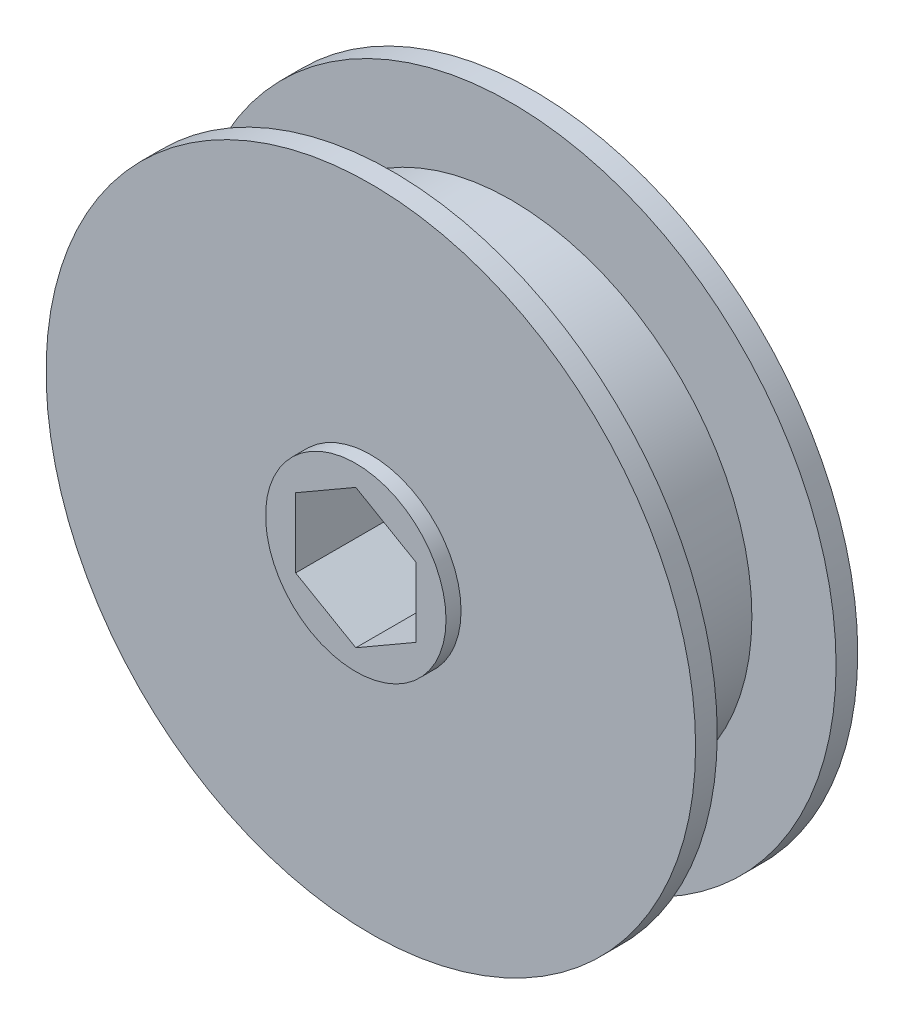
ISO-10303-21;
HEADER;
FILE_DESCRIPTION(('STEP AP214'),'2;1');
FILE_NAME('part.step','',(''),(''),'','','');
FILE_SCHEMA(('AUTOMOTIVE_DESIGN { 1 0 10303 214 1 1 1 1 }'));
ENDSEC;
DATA;
#1=APPLICATION_CONTEXT('core data for automotive mechanical design processes');
#2=APPLICATION_PROTOCOL_DEFINITION('international standard','automotive_design',2000,#1);
#3=PRODUCT_CONTEXT('',#1,'mechanical');
#4=PRODUCT('Part','Part','',(#3));
#5=PRODUCT_RELATED_PRODUCT_CATEGORY('part','',(#4));
#6=PRODUCT_DEFINITION_FORMATION('','',#4);
#7=PRODUCT_DEFINITION_CONTEXT('part definition',#1,'design');
#8=PRODUCT_DEFINITION('design','',#6,#7);
#9=PRODUCT_DEFINITION_SHAPE('','',#8);
#10=(LENGTH_UNIT() NAMED_UNIT(*) SI_UNIT(.MILLI.,.METRE.));
#11=(NAMED_UNIT(*) PLANE_ANGLE_UNIT() SI_UNIT($,.RADIAN.));
#12=(NAMED_UNIT(*) SI_UNIT($,.STERADIAN.) SOLID_ANGLE_UNIT());
#13=UNCERTAINTY_MEASURE_WITH_UNIT(LENGTH_MEASURE(1.E-05),#10,'distance_accuracy_value','');
#14=(GEOMETRIC_REPRESENTATION_CONTEXT(3) GLOBAL_UNCERTAINTY_ASSIGNED_CONTEXT((#13)) GLOBAL_UNIT_ASSIGNED_CONTEXT((#10,
#11,#12)) REPRESENTATION_CONTEXT('',''));
#15=CARTESIAN_POINT('',(0.,0.,0.));
#16=DIRECTION('',(0.,0.,1.));
#17=DIRECTION('',(1.,0.,0.));
#18=AXIS2_PLACEMENT_3D('',#15,#16,#17);
#19=CARTESIAN_POINT('',(0.,0.,-10.1473));
#20=DIRECTION('',(0.,0.,1.));
#21=DIRECTION('',(1.,0.,0.));
#22=AXIS2_PLACEMENT_3D('',#19,#20,#21);
#23=CYLINDRICAL_SURFACE('',#22,34.29);
#24=CARTESIAN_POINT('',(0.,0.,-6.2738));
#25=DIRECTION('',(0.,0.,1.));
#26=DIRECTION('',(1.,0.,0.));
#27=AXIS2_PLACEMENT_3D('',#24,#25,#26);
#28=CIRCLE('',#27,34.29);
#29=CARTESIAN_POINT('',(34.29,0.,-6.2738));
#30=VERTEX_POINT('',#29);
#31=EDGE_CURVE('E139',#30,#30,#28,.T.);
#32=ORIENTED_EDGE('',*,*,#31,.F.);
#33=EDGE_LOOP('',(#32));
#34=FACE_BOUND('',#33,.T.);
#35=CARTESIAN_POINT('',(0.,0.,-8.5598));
#36=DIRECTION('',(0.,0.,1.));
#37=DIRECTION('',(1.,0.,0.));
#38=AXIS2_PLACEMENT_3D('',#35,#36,#37);
#39=CIRCLE('',#38,34.29);
#40=CARTESIAN_POINT('',(34.29,0.,-8.5598));
#41=VERTEX_POINT('',#40);
#42=EDGE_CURVE('E116',#41,#41,#39,.T.);
#43=ORIENTED_EDGE('',*,*,#42,.T.);
#44=EDGE_LOOP('',(#43));
#45=FACE_BOUND('',#44,.T.);
#46=ADVANCED_FACE('F45',(#34,#45),#23,.T.);
#47=CARTESIAN_POINT('',(0.,0.,-10.1473));
#48=DIRECTION('',(0.,0.,-1.));
#49=DIRECTION('',(1.,0.,0.));
#50=AXIS2_PLACEMENT_3D('',#47,#48,#49);
#51=PLANE('',#50);
#52=DIRECTION('',(-0.866025403784441,0.499999999999995,0.));
#53=VECTOR('',#52,1.);
#54=CARTESIAN_POINT('',(6.34999999999996,3.6661742093542,-10.1473));
#55=LINE('',#54,#53);
#56=CARTESIAN_POINT('',(6.34999999999996,3.6661742093542,-10.1473));
#57=VERTEX_POINT('',#56);
#58=CARTESIAN_POINT('',(0.,7.33234841870825,-10.1473));
#59=VERTEX_POINT('',#58);
#60=EDGE_CURVE('E110',#57,#59,#55,.T.);
#61=ORIENTED_EDGE('',*,*,#60,.T.);
#62=DIRECTION('',(-0.866025403784438,-0.500000000000001,0.));
#63=VECTOR('',#62,1.);
#64=CARTESIAN_POINT('',(0.,7.33234841870825,-10.1473));
#65=LINE('',#64,#63);
#66=CARTESIAN_POINT('',(-6.35000000000001,3.66617420935411,-10.1473));
#67=VERTEX_POINT('',#66);
#68=EDGE_CURVE('E136',#59,#67,#65,.T.);
#69=ORIENTED_EDGE('',*,*,#68,.T.);
#70=DIRECTION('',(0.,-1.,0.));
#71=VECTOR('',#70,1.);
#72=CARTESIAN_POINT('',(-6.35000000000001,3.66617420935411,-10.1473));
#73=LINE('',#72,#71);
#74=CARTESIAN_POINT('',(-6.34999999999998,-3.66617420935415,-10.1473));
#75=VERTEX_POINT('',#74);
#76=EDGE_CURVE('E132',#67,#75,#73,.T.);
#77=ORIENTED_EDGE('',*,*,#76,.T.);
#78=DIRECTION('',(0.866025403784441,-0.499999999999995,0.));
#79=VECTOR('',#78,1.);
#80=CARTESIAN_POINT('',(-6.34999999999998,-3.66617420935415,-10.1473));
#81=LINE('',#80,#79);
#82=CARTESIAN_POINT('',(0.,-7.33234841870825,-10.1473));
#83=VERTEX_POINT('',#82);
#84=EDGE_CURVE('E126',#75,#83,#81,.T.);
#85=ORIENTED_EDGE('',*,*,#84,.T.);
#86=DIRECTION('',(0.866025403784435,0.500000000000007,0.));
#87=VECTOR('',#86,1.);
#88=CARTESIAN_POINT('',(0.,-7.33234841870825,-10.1473));
#89=LINE('',#88,#87);
#90=CARTESIAN_POINT('',(6.35000000000003,-3.66617420935406,-10.1473));
#91=VERTEX_POINT('',#90);
#92=EDGE_CURVE('E122',#83,#91,#89,.T.);
#93=ORIENTED_EDGE('',*,*,#92,.T.);
#94=DIRECTION('',(0.,1.,0.));
#95=VECTOR('',#94,1.);
#96=CARTESIAN_POINT('',(6.35000000000003,-3.66617420935406,-10.1473));
#97=LINE('',#96,#95);
#98=EDGE_CURVE('E101',#91,#57,#97,.T.);
#99=ORIENTED_EDGE('',*,*,#98,.T.);
#100=EDGE_LOOP('',(#61,#69,#77,#85,#93,#99));
#101=FACE_BOUND('',#100,.T.);
#102=CARTESIAN_POINT('',(0.,0.,-10.1473));
#103=DIRECTION('',(0.,0.,1.));
#104=DIRECTION('',(1.,0.,0.));
#105=AXIS2_PLACEMENT_3D('',#102,#103,#104);
#106=CIRCLE('',#105,9.525);
#107=CARTESIAN_POINT('',(9.525,0.,-10.1473));
#108=VERTEX_POINT('',#107);
#109=EDGE_CURVE('E253',#108,#108,#106,.T.);
#110=ORIENTED_EDGE('',*,*,#109,.F.);
#111=EDGE_LOOP('',(#110));
#112=FACE_BOUND('',#111,.T.);
#113=ADVANCED_FACE('F118',(#101,#112),#51,.T.);
#114=CARTESIAN_POINT('',(0.,0.,8.21055));
#115=DIRECTION('',(0.,0.,-1.));
#116=DIRECTION('',(-1.,0.,0.));
#117=AXIS2_PLACEMENT_3D('',#114,#115,#116);
#118=CYLINDRICAL_SURFACE('',#117,25.4);
#119=CARTESIAN_POINT('',(0.,0.,6.2738));
#120=DIRECTION('',(0.,0.,1.));
#121=DIRECTION('',(1.,0.,0.));
#122=AXIS2_PLACEMENT_3D('',#119,#120,#121);
#123=CIRCLE('',#122,25.4);
#124=CARTESIAN_POINT('',(25.4,0.,6.2738));
#125=VERTEX_POINT('',#124);
#126=EDGE_CURVE('E55',#125,#125,#123,.T.);
#127=ORIENTED_EDGE('',*,*,#126,.F.);
#128=EDGE_LOOP('',(#127));
#129=FACE_BOUND('',#128,.T.);
#130=CARTESIAN_POINT('',(0.,0.,-6.2738));
#131=DIRECTION('',(0.,0.,-1.));
#132=DIRECTION('',(-1.,0.,0.));
#133=AXIS2_PLACEMENT_3D('',#130,#131,#132);
#134=CIRCLE('',#133,25.4);
#135=CARTESIAN_POINT('',(-25.4,0.,-6.2738));
#136=VERTEX_POINT('',#135);
#137=EDGE_CURVE('E11',#136,#136,#134,.T.);
#138=ORIENTED_EDGE('',*,*,#137,.F.);
#139=EDGE_LOOP('',(#138));
#140=FACE_BOUND('',#139,.T.);
#141=ADVANCED_FACE('F47',(#129,#140),#118,.T.);
#142=CARTESIAN_POINT('',(0.,0.,10.1473));
#143=DIRECTION('',(0.,0.,1.));
#144=DIRECTION('',(1.,0.,0.));
#145=AXIS2_PLACEMENT_3D('',#142,#143,#144);
#146=PLANE('',#145);
#147=DIRECTION('',(-0.866025403784438,-0.500000000000001,0.));
#148=VECTOR('',#147,1.);
#149=CARTESIAN_POINT('',(0.,7.33234841870825,10.1473));
#150=LINE('',#149,#148);
#151=CARTESIAN_POINT('',(0.,7.33234841870825,10.1473));
#152=VERTEX_POINT('',#151);
#153=CARTESIAN_POINT('',(-6.35000000000001,3.66617420935411,10.1473));
#154=VERTEX_POINT('',#153);
#155=EDGE_CURVE('E158',#152,#154,#150,.T.);
#156=ORIENTED_EDGE('',*,*,#155,.F.);
#157=DIRECTION('',(-0.866025403784441,0.499999999999995,0.));
#158=VECTOR('',#157,1.);
#159=CARTESIAN_POINT('',(6.34999999999996,3.6661742093542,10.1473));
#160=LINE('',#159,#158);
#161=CARTESIAN_POINT('',(6.34999999999996,3.6661742093542,10.1473));
#162=VERTEX_POINT('',#161);
#163=EDGE_CURVE('E155',#162,#152,#160,.T.);
#164=ORIENTED_EDGE('',*,*,#163,.F.);
#165=DIRECTION('',(0.,1.,0.));
#166=VECTOR('',#165,1.);
#167=CARTESIAN_POINT('',(6.35000000000003,-3.66617420935406,10.1473));
#168=LINE('',#167,#166);
#169=CARTESIAN_POINT('',(6.35000000000003,-3.66617420935406,10.1473));
#170=VERTEX_POINT('',#169);
#171=EDGE_CURVE('E104',#170,#162,#168,.T.);
#172=ORIENTED_EDGE('',*,*,#171,.F.);
#173=DIRECTION('',(0.866025403784435,0.500000000000007,0.));
#174=VECTOR('',#173,1.);
#175=CARTESIAN_POINT('',(0.,-7.33234841870825,10.1473));
#176=LINE('',#175,#174);
#177=CARTESIAN_POINT('',(0.,-7.33234841870825,10.1473));
#178=VERTEX_POINT('',#177);
#179=EDGE_CURVE('E170',#178,#170,#176,.T.);
#180=ORIENTED_EDGE('',*,*,#179,.F.);
#181=DIRECTION('',(0.866025403784441,-0.499999999999995,0.));
#182=VECTOR('',#181,1.);
#183=CARTESIAN_POINT('',(-6.34999999999998,-3.66617420935415,10.1473));
#184=LINE('',#183,#182);
#185=CARTESIAN_POINT('',(-6.34999999999998,-3.66617420935415,10.1473));
#186=VERTEX_POINT('',#185);
#187=EDGE_CURVE('E166',#186,#178,#184,.T.);
#188=ORIENTED_EDGE('',*,*,#187,.F.);
#189=DIRECTION('',(0.,-1.,0.));
#190=VECTOR('',#189,1.);
#191=CARTESIAN_POINT('',(-6.35000000000001,3.66617420935411,10.1473));
#192=LINE('',#191,#190);
#193=EDGE_CURVE('E162',#154,#186,#192,.T.);
#194=ORIENTED_EDGE('',*,*,#193,.F.);
#195=EDGE_LOOP('',(#156,#164,#172,#180,#188,#194));
#196=FACE_BOUND('',#195,.T.);
#197=CARTESIAN_POINT('',(0.,0.,10.1473));
#198=DIRECTION('',(0.,0.,1.));
#199=DIRECTION('',(1.,0.,0.));
#200=AXIS2_PLACEMENT_3D('',#197,#198,#199);
#201=CIRCLE('',#200,9.525);
#202=CARTESIAN_POINT('',(9.525,0.,10.1473));
#203=VERTEX_POINT('',#202);
#204=EDGE_CURVE('E142',#203,#203,#201,.T.);
#205=ORIENTED_EDGE('',*,*,#204,.T.);
#206=EDGE_LOOP('',(#205));
#207=FACE_BOUND('',#206,.T.);
#208=ADVANCED_FACE('F206',(#196,#207),#146,.T.);
#209=CARTESIAN_POINT('',(0.,0.,10.1473));
#210=DIRECTION('',(0.,0.,-1.));
#211=DIRECTION('',(-1.,0.,0.));
#212=AXIS2_PLACEMENT_3D('',#209,#210,#211);
#213=CYLINDRICAL_SURFACE('',#212,34.29);
#214=CARTESIAN_POINT('',(0.,0.,6.2738));
#215=DIRECTION('',(0.,0.,1.));
#216=DIRECTION('',(1.,0.,0.));
#217=AXIS2_PLACEMENT_3D('',#214,#215,#216);
#218=CIRCLE('',#217,34.29);
#219=CARTESIAN_POINT('',(34.29,0.,6.2738));
#220=VERTEX_POINT('',#219);
#221=EDGE_CURVE('E107',#220,#220,#218,.T.);
#222=ORIENTED_EDGE('',*,*,#221,.T.);
#223=EDGE_LOOP('',(#222));
#224=FACE_BOUND('',#223,.T.);
#225=CARTESIAN_POINT('',(0.,0.,8.5598));
#226=DIRECTION('',(0.,0.,1.));
#227=DIRECTION('',(1.,0.,0.));
#228=AXIS2_PLACEMENT_3D('',#225,#226,#227);
#229=CIRCLE('',#228,34.29);
#230=CARTESIAN_POINT('',(34.29,0.,8.5598));
#231=VERTEX_POINT('',#230);
#232=EDGE_CURVE('E148',#231,#231,#229,.T.);
#233=ORIENTED_EDGE('',*,*,#232,.F.);
#234=EDGE_LOOP('',(#233));
#235=FACE_BOUND('',#234,.T.);
#236=ADVANCED_FACE('F209',(#224,#235),#213,.T.);
#237=CARTESIAN_POINT('',(6.34999999999999,3.66617420935413,8.21055));
#238=DIRECTION('',(-0.5,-0.866025403784439,0.));
#239=DIRECTION('',(0.866025403784439,-0.5,0.));
#240=AXIS2_PLACEMENT_3D('',#237,#238,#239);
#241=PLANE('',#240);
#242=ORIENTED_EDGE('',*,*,#60,.F.);
#243=DIRECTION('',(0.,0.,-1.));
#244=VECTOR('',#243,1.);
#245=CARTESIAN_POINT('',(6.34999999999999,3.66617420935413,8.21055));
#246=LINE('',#245,#244);
#247=EDGE_CURVE('E71',#162,#57,#246,.T.);
#248=ORIENTED_EDGE('',*,*,#247,.F.);
#249=ORIENTED_EDGE('',*,*,#163,.T.);
#250=DIRECTION('',(0.,0.,-1.));
#251=VECTOR('',#250,1.);
#252=CARTESIAN_POINT('',(0.,7.33234841870825,8.21055));
#253=LINE('',#252,#251);
#254=EDGE_CURVE('E49',#152,#59,#253,.T.);
#255=ORIENTED_EDGE('',*,*,#254,.T.);
#256=EDGE_LOOP('',(#242,#248,#249,#255));
#257=FACE_BOUND('',#256,.T.);
#258=ADVANCED_FACE('F111',(#257),#241,.T.);
#259=CARTESIAN_POINT('',(0.,7.33234841870825,8.21055));
#260=DIRECTION('',(0.5,-0.866025403784439,0.));
#261=DIRECTION('',(0.866025403784439,0.5,0.));
#262=AXIS2_PLACEMENT_3D('',#259,#260,#261);
#263=PLANE('',#262);
#264=ORIENTED_EDGE('',*,*,#68,.F.);
#265=ORIENTED_EDGE('',*,*,#254,.F.);
#266=ORIENTED_EDGE('',*,*,#155,.T.);
#267=DIRECTION('',(0.,0.,-1.));
#268=VECTOR('',#267,1.);
#269=CARTESIAN_POINT('',(-6.35,3.66617420935412,8.21055));
#270=LINE('',#269,#268);
#271=EDGE_CURVE('E188',#154,#67,#270,.T.);
#272=ORIENTED_EDGE('',*,*,#271,.T.);
#273=EDGE_LOOP('',(#264,#265,#266,#272));
#274=FACE_BOUND('',#273,.T.);
#275=ADVANCED_FACE('F193',(#274),#263,.T.);
#276=CARTESIAN_POINT('',(-6.35,3.66617420935412,8.21055));
#277=DIRECTION('',(1.,0.,0.));
#278=DIRECTION('',(0.,1.,0.));
#279=AXIS2_PLACEMENT_3D('',#276,#277,#278);
#280=PLANE('',#279);
#281=ORIENTED_EDGE('',*,*,#76,.F.);
#282=ORIENTED_EDGE('',*,*,#271,.F.);
#283=ORIENTED_EDGE('',*,*,#193,.T.);
#284=DIRECTION('',(0.,0.,-1.));
#285=VECTOR('',#284,1.);
#286=CARTESIAN_POINT('',(-6.35,-3.66617420935412,8.21055));
#287=LINE('',#286,#285);
#288=EDGE_CURVE('E186',#186,#75,#287,.T.);
#289=ORIENTED_EDGE('',*,*,#288,.T.);
#290=EDGE_LOOP('',(#281,#282,#283,#289));
#291=FACE_BOUND('',#290,.T.);
#292=ADVANCED_FACE('F197',(#291),#280,.T.);
#293=CARTESIAN_POINT('',(-6.35,-3.66617420935412,8.21055));
#294=DIRECTION('',(0.5,0.866025403784439,0.));
#295=DIRECTION('',(-0.866025403784439,0.5,0.));
#296=AXIS2_PLACEMENT_3D('',#293,#294,#295);
#297=PLANE('',#296);
#298=ORIENTED_EDGE('',*,*,#84,.F.);
#299=ORIENTED_EDGE('',*,*,#288,.F.);
#300=ORIENTED_EDGE('',*,*,#187,.T.);
#301=DIRECTION('',(0.,0.,-1.));
#302=VECTOR('',#301,1.);
#303=CARTESIAN_POINT('',(0.,-7.33234841870825,8.21055));
#304=LINE('',#303,#302);
#305=EDGE_CURVE('E183',#178,#83,#304,.T.);
#306=ORIENTED_EDGE('',*,*,#305,.T.);
#307=EDGE_LOOP('',(#298,#299,#300,#306));
#308=FACE_BOUND('',#307,.T.);
#309=ADVANCED_FACE('F200',(#308),#297,.T.);
#310=CARTESIAN_POINT('',(0.,-7.33234841870825,8.21055));
#311=DIRECTION('',(-0.5,0.866025403784439,0.));
#312=DIRECTION('',(-0.866025403784439,-0.5,0.));
#313=AXIS2_PLACEMENT_3D('',#310,#311,#312);
#314=PLANE('',#313);
#315=ORIENTED_EDGE('',*,*,#92,.F.);
#316=ORIENTED_EDGE('',*,*,#305,.F.);
#317=ORIENTED_EDGE('',*,*,#179,.T.);
#318=DIRECTION('',(0.,0.,-1.));
#319=VECTOR('',#318,1.);
#320=CARTESIAN_POINT('',(6.34999999999999,-3.66617420935413,8.21055));
#321=LINE('',#320,#319);
#322=EDGE_CURVE('E63',#170,#91,#321,.T.);
#323=ORIENTED_EDGE('',*,*,#322,.T.);
#324=EDGE_LOOP('',(#315,#316,#317,#323));
#325=FACE_BOUND('',#324,.T.);
#326=ADVANCED_FACE('F204',(#325),#314,.T.);
#327=CARTESIAN_POINT('',(6.34999999999999,-3.66617420935413,8.21055));
#328=DIRECTION('',(-1.,0.,0.));
#329=DIRECTION('',(0.,0.,1.));
#330=AXIS2_PLACEMENT_3D('',#327,#328,#329);
#331=PLANE('',#330);
#332=ORIENTED_EDGE('',*,*,#98,.F.);
#333=ORIENTED_EDGE('',*,*,#322,.F.);
#334=ORIENTED_EDGE('',*,*,#171,.T.);
#335=ORIENTED_EDGE('',*,*,#247,.T.);
#336=EDGE_LOOP('',(#332,#333,#334,#335));
#337=FACE_BOUND('',#336,.T.);
#338=ADVANCED_FACE('F99',(#337),#331,.T.);
#339=CARTESIAN_POINT('',(0.,0.,6.2738));
#340=DIRECTION('',(0.,0.,1.));
#341=DIRECTION('',(1.,0.,0.));
#342=AXIS2_PLACEMENT_3D('',#339,#340,#341);
#343=PLANE('',#342);
#344=ORIENTED_EDGE('',*,*,#221,.F.);
#345=EDGE_LOOP('',(#344));
#346=FACE_BOUND('',#345,.T.);
#347=ORIENTED_EDGE('',*,*,#126,.T.);
#348=EDGE_LOOP('',(#347));
#349=FACE_BOUND('',#348,.T.);
#350=ADVANCED_FACE('F227',(#346,#349),#343,.F.);
#351=CARTESIAN_POINT('',(0.,0.,8.5598));
#352=DIRECTION('',(0.,0.,1.));
#353=DIRECTION('',(1.,0.,0.));
#354=AXIS2_PLACEMENT_3D('',#351,#352,#353);
#355=PLANE('',#354);
#356=CARTESIAN_POINT('',(0.,0.,8.5598));
#357=DIRECTION('',(0.,0.,1.));
#358=DIRECTION('',(1.,0.,0.));
#359=AXIS2_PLACEMENT_3D('',#356,#357,#358);
#360=CIRCLE('',#359,9.525);
#361=CARTESIAN_POINT('',(9.525,0.,8.5598));
#362=VERTEX_POINT('',#361);
#363=EDGE_CURVE('E144',#362,#362,#360,.T.);
#364=ORIENTED_EDGE('',*,*,#363,.F.);
#365=EDGE_LOOP('',(#364));
#366=FACE_BOUND('',#365,.T.);
#367=ORIENTED_EDGE('',*,*,#232,.T.);
#368=EDGE_LOOP('',(#367));
#369=FACE_BOUND('',#368,.T.);
#370=ADVANCED_FACE('F216',(#366,#369),#355,.T.);
#371=CARTESIAN_POINT('',(0.,0.,8.5598));
#372=DIRECTION('',(0.,0.,1.));
#373=DIRECTION('',(1.,0.,0.));
#374=AXIS2_PLACEMENT_3D('',#371,#372,#373);
#375=CYLINDRICAL_SURFACE('',#374,9.525);
#376=ORIENTED_EDGE('',*,*,#363,.T.);
#377=EDGE_LOOP('',(#376));
#378=FACE_BOUND('',#377,.T.);
#379=ORIENTED_EDGE('',*,*,#204,.F.);
#380=EDGE_LOOP('',(#379));
#381=FACE_BOUND('',#380,.T.);
#382=ADVANCED_FACE('F213',(#378,#381),#375,.T.);
#383=CARTESIAN_POINT('',(0.,0.,-6.2738));
#384=DIRECTION('',(0.,0.,-1.));
#385=DIRECTION('',(1.,0.,0.));
#386=AXIS2_PLACEMENT_3D('',#383,#384,#385);
#387=PLANE('',#386);
#388=ORIENTED_EDGE('',*,*,#31,.T.);
#389=EDGE_LOOP('',(#388));
#390=FACE_BOUND('',#389,.T.);
#391=ORIENTED_EDGE('',*,*,#137,.T.);
#392=EDGE_LOOP('',(#391));
#393=FACE_BOUND('',#392,.T.);
#394=ADVANCED_FACE('F215',(#390,#393),#387,.F.);
#395=CARTESIAN_POINT('',(0.,0.,-8.5598));
#396=DIRECTION('',(0.,0.,-1.));
#397=DIRECTION('',(1.,0.,0.));
#398=AXIS2_PLACEMENT_3D('',#395,#396,#397);
#399=PLANE('',#398);
#400=ORIENTED_EDGE('',*,*,#42,.F.);
#401=EDGE_LOOP('',(#400));
#402=FACE_BOUND('',#401,.T.);
#403=CARTESIAN_POINT('',(0.,0.,-8.5598));
#404=DIRECTION('',(0.,0.,1.));
#405=DIRECTION('',(1.,0.,0.));
#406=AXIS2_PLACEMENT_3D('',#403,#404,#405);
#407=CIRCLE('',#406,9.525);
#408=CARTESIAN_POINT('',(9.525,0.,-8.5598));
#409=VERTEX_POINT('',#408);
#410=EDGE_CURVE('E250',#409,#409,#407,.T.);
#411=ORIENTED_EDGE('',*,*,#410,.T.);
#412=EDGE_LOOP('',(#411));
#413=FACE_BOUND('',#412,.T.);
#414=ADVANCED_FACE('F224',(#402,#413),#399,.T.);
#415=CARTESIAN_POINT('',(0.,0.,-8.5598));
#416=DIRECTION('',(0.,0.,-1.));
#417=DIRECTION('',(-1.,0.,0.));
#418=AXIS2_PLACEMENT_3D('',#415,#416,#417);
#419=CYLINDRICAL_SURFACE('',#418,9.525);
#420=ORIENTED_EDGE('',*,*,#410,.F.);
#421=EDGE_LOOP('',(#420));
#422=FACE_BOUND('',#421,.T.);
#423=ORIENTED_EDGE('',*,*,#109,.T.);
#424=EDGE_LOOP('',(#423));
#425=FACE_BOUND('',#424,.T.);
#426=ADVANCED_FACE('F241',(#422,#425),#419,.T.);
#427=CLOSED_SHELL('',(#46,#113,#141,#208,#236,#258,#275,#292,#309,#326,#338,#350,#370,#382,#394,
#414,#426));
#428=MANIFOLD_SOLID_BREP('B2',#427);
#429=ADVANCED_BREP_SHAPE_REPRESENTATION('',(#18,#428),#14);
#430=SHAPE_DEFINITION_REPRESENTATION(#9,#429);
ENDSEC;
END-ISO-10303-21;
